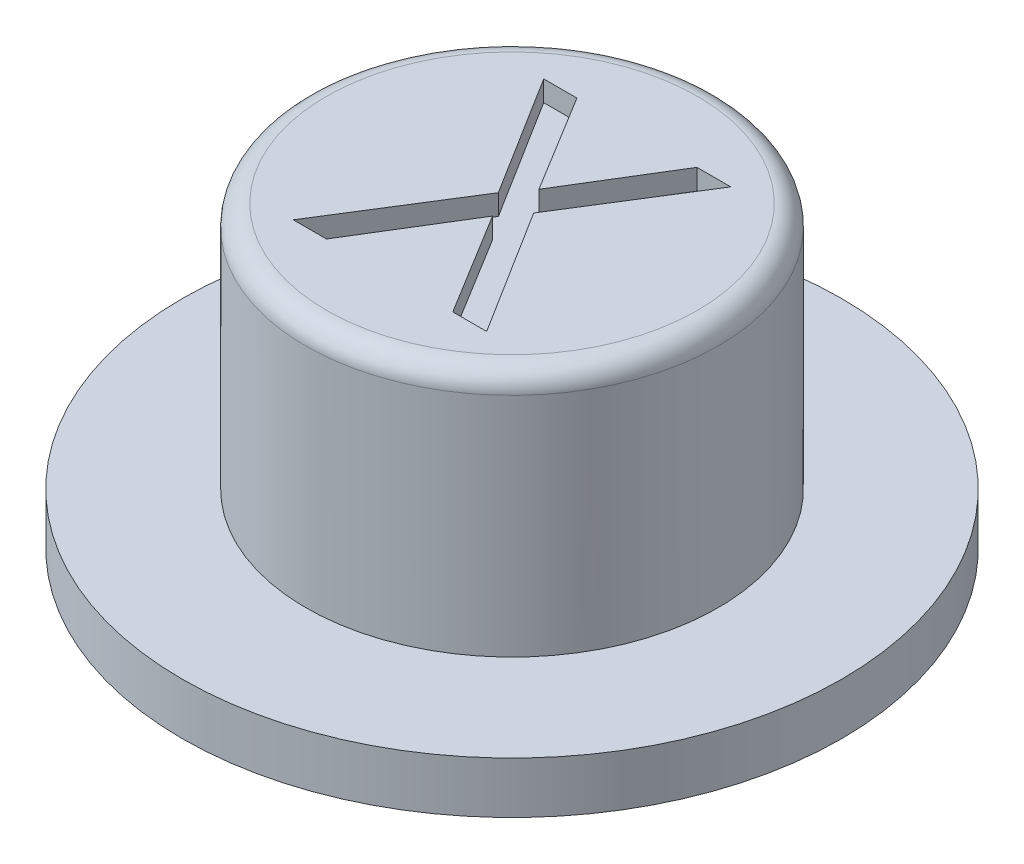
ISO-10303-21;
HEADER;
FILE_DESCRIPTION(('STEP AP214'),'2;1');
FILE_NAME('part.step','',(''),(''),'','','');
FILE_SCHEMA(('AUTOMOTIVE_DESIGN { 1 0 10303 214 1 1 1 1 }'));
ENDSEC;
DATA;
#1=APPLICATION_CONTEXT('core data for automotive mechanical design processes');
#2=APPLICATION_PROTOCOL_DEFINITION('international standard','automotive_design',2000,#1);
#3=PRODUCT_CONTEXT('',#1,'mechanical');
#4=PRODUCT('Part','Part','',(#3));
#5=PRODUCT_RELATED_PRODUCT_CATEGORY('part','',(#4));
#6=PRODUCT_DEFINITION_FORMATION('','',#4);
#7=PRODUCT_DEFINITION_CONTEXT('part definition',#1,'design');
#8=PRODUCT_DEFINITION('design','',#6,#7);
#9=PRODUCT_DEFINITION_SHAPE('','',#8);
#10=(LENGTH_UNIT() NAMED_UNIT(*) SI_UNIT(.MILLI.,.METRE.));
#11=(NAMED_UNIT(*) PLANE_ANGLE_UNIT() SI_UNIT($,.RADIAN.));
#12=(NAMED_UNIT(*) SI_UNIT($,.STERADIAN.) SOLID_ANGLE_UNIT());
#13=UNCERTAINTY_MEASURE_WITH_UNIT(LENGTH_MEASURE(1.E-05),#10,'distance_accuracy_value','');
#14=(GEOMETRIC_REPRESENTATION_CONTEXT(3) GLOBAL_UNCERTAINTY_ASSIGNED_CONTEXT((#13)) GLOBAL_UNIT_ASSIGNED_CONTEXT((#10,
#11,#12)) REPRESENTATION_CONTEXT('',''));
#15=CARTESIAN_POINT('',(0.,0.,0.));
#16=DIRECTION('',(0.,0.,1.));
#17=DIRECTION('',(1.,0.,0.));
#18=AXIS2_PLACEMENT_3D('',#15,#16,#17);
#19=CARTESIAN_POINT('',(0.,7.24999999999999,0.));
#20=DIRECTION('',(0.,-1.,0.));
#21=DIRECTION('',(1.,0.,0.));
#22=AXIS2_PLACEMENT_3D('',#19,#20,#21);
#23=PLANE('',#22);
#24=CARTESIAN_POINT('',(0.,7.24999999999999,0.));
#25=DIRECTION('',(0.,-1.,0.));
#26=DIRECTION('',(1.,0.,0.));
#27=AXIS2_PLACEMENT_3D('',#24,#25,#26);
#28=CIRCLE('',#27,4.49999999999999);
#29=CARTESIAN_POINT('',(4.49999999999999,7.25,0.));
#30=VERTEX_POINT('',#29);
#31=EDGE_CURVE('E41',#30,#30,#28,.F.);
#32=ORIENTED_EDGE('',*,*,#31,.T.);
#33=EDGE_LOOP('',(#32));
#34=FACE_BOUND('',#33,.T.);
#35=DIRECTION('',(-0.530652621464219,0.,-0.847589402560669));
#36=VECTOR('',#35,1.);
#37=CARTESIAN_POINT('',(-0.389423076923096,7.24999999999999,-0.0588942307692309));
#38=LINE('',#37,#36);
#39=CARTESIAN_POINT('',(-0.389423076923096,7.24999999999999,-0.0588942307692309));
#40=VERTEX_POINT('',#39);
#41=CARTESIAN_POINT('',(-2.23076923076925,7.24999999999999,-3.));
#42=VERTEX_POINT('',#41);
#43=EDGE_CURVE('E48',#40,#42,#38,.T.);
#44=ORIENTED_EDGE('',*,*,#43,.T.);
#45=DIRECTION('',(1.,0.,0.));
#46=VECTOR('',#45,1.);
#47=CARTESIAN_POINT('',(-2.23076923076925,7.24999999999999,-3.));
#48=LINE('',#47,#46);
#49=CARTESIAN_POINT('',(-1.42427884615387,7.24999999999999,-3.));
#50=VERTEX_POINT('',#49);
#51=EDGE_CURVE('E167',#42,#50,#48,.T.);
#52=ORIENTED_EDGE('',*,*,#51,.T.);
#53=DIRECTION('',(0.52214745933487,0.,0.852855222596509));
#54=VECTOR('',#53,1.);
#55=CARTESIAN_POINT('',(-1.42427884615387,7.24999999999999,-3.));
#56=LINE('',#55,#54);
#57=CARTESIAN_POINT('',(0.0312499999999809,7.24999999999999,-0.622596153846154));
#58=VERTEX_POINT('',#57);
#59=EDGE_CURVE('E497',#50,#58,#56,.T.);
#60=ORIENTED_EDGE('',*,*,#59,.T.);
#61=DIRECTION('',(0.52214745933487,0.,-0.852855222596509));
#62=VECTOR('',#61,1.);
#63=CARTESIAN_POINT('',(0.0312499999999809,7.24999999999999,-0.622596153846154));
#64=LINE('',#63,#62);
#65=CARTESIAN_POINT('',(1.48677884615383,7.25,-3.));
#66=VERTEX_POINT('',#65);
#67=EDGE_CURVE('E499',#58,#66,#64,.T.);
#68=ORIENTED_EDGE('',*,*,#67,.T.);
#69=DIRECTION('',(1.,0.,0.));
#70=VECTOR('',#69,1.);
#71=CARTESIAN_POINT('',(1.48677884615383,7.25,-3.));
#72=LINE('',#71,#70);
#73=CARTESIAN_POINT('',(2.30769230769229,7.25,-3.));
#74=VERTEX_POINT('',#73);
#75=EDGE_CURVE('E503',#66,#74,#72,.T.);
#76=ORIENTED_EDGE('',*,*,#75,.T.);
#77=DIRECTION('',(-0.530808451043768,0.,0.847491821966747));
#78=VECTOR('',#77,1.);
#79=CARTESIAN_POINT('',(2.30769230769229,7.25,-3.));
#80=LINE('',#79,#78);
#81=CARTESIAN_POINT('',(0.466346153846135,7.24999999999999,-0.0600961538461541));
#82=VERTEX_POINT('',#81);
#83=EDGE_CURVE('E510',#74,#82,#80,.T.);
#84=ORIENTED_EDGE('',*,*,#83,.T.);
#85=DIRECTION('',(0.53113518975577,0.,0.847287088419918));
#86=VECTOR('',#85,1.);
#87=CARTESIAN_POINT('',(0.466346153846135,7.24999999999999,-0.0600961538461541));
#88=LINE('',#87,#86);
#89=CARTESIAN_POINT('',(2.38461538461537,7.25,3.));
#90=VERTEX_POINT('',#89);
#91=EDGE_CURVE('E513',#82,#90,#88,.T.);
#92=ORIENTED_EDGE('',*,*,#91,.T.);
#93=DIRECTION('',(-1.,0.,0.));
#94=VECTOR('',#93,1.);
#95=CARTESIAN_POINT('',(2.38461538461537,7.25,3.));
#96=LINE('',#95,#94);
#97=CARTESIAN_POINT('',(1.5637019230769,7.25,3.));
#98=VERTEX_POINT('',#97);
#99=EDGE_CURVE('E516',#90,#98,#96,.T.);
#100=ORIENTED_EDGE('',*,*,#99,.T.);
#101=DIRECTION('',(-0.52315847749221,0.,-0.852235417844173));
#102=VECTOR('',#101,1.);
#103=CARTESIAN_POINT('',(1.5637019230769,7.25,3.));
#104=LINE('',#103,#102);
#105=CARTESIAN_POINT('',(0.0312499999999809,7.24999999999999,0.503605769230769));
#106=VERTEX_POINT('',#105);
#107=EDGE_CURVE('E473',#98,#106,#104,.T.);
#108=ORIENTED_EDGE('',*,*,#107,.T.);
#109=DIRECTION('',(-0.52315847749221,0.,0.852235417844173));
#110=VECTOR('',#109,1.);
#111=CARTESIAN_POINT('',(0.0312499999999809,7.24999999999999,0.503605769230769));
#112=LINE('',#111,#110);
#113=CARTESIAN_POINT('',(-1.50120192307694,7.24999999999999,3.));
#114=VERTEX_POINT('',#113);
#115=EDGE_CURVE('E470',#106,#114,#112,.T.);
#116=ORIENTED_EDGE('',*,*,#115,.T.);
#117=DIRECTION('',(-1.,0.,0.));
#118=VECTOR('',#117,1.);
#119=CARTESIAN_POINT('',(-1.50120192307694,7.24999999999999,3.));
#120=LINE('',#119,#118);
#121=CARTESIAN_POINT('',(-2.30769230769233,7.24999999999999,3.));
#122=VERTEX_POINT('',#121);
#123=EDGE_CURVE('E464',#114,#122,#120,.T.);
#124=ORIENTED_EDGE('',*,*,#123,.T.);
#125=DIRECTION('',(0.531284987838168,0.,-0.847193166696827));
#126=VECTOR('',#125,1.);
#127=CARTESIAN_POINT('',(-2.30769230769233,7.24999999999999,3.));
#128=LINE('',#127,#126);
#129=EDGE_CURVE('E163',#122,#40,#128,.T.);
#130=ORIENTED_EDGE('',*,*,#129,.T.);
#131=EDGE_LOOP('',(#44,#52,#60,#68,#76,#84,#92,#100,#108,#116,#124,#130));
#132=FACE_BOUND('',#131,.T.);
#133=ADVANCED_FACE('F33',(#34,#132),#23,.F.);
#134=CARTESIAN_POINT('',(0.,0.,0.));
#135=DIRECTION('',(0.,1.,0.));
#136=DIRECTION('',(-1.,0.,0.));
#137=AXIS2_PLACEMENT_3D('',#134,#135,#136);
#138=PLANE('',#137);
#139=CARTESIAN_POINT('',(0.,0.,0.));
#140=DIRECTION('',(0.,1.,0.));
#141=DIRECTION('',(-1.,0.,0.));
#142=AXIS2_PLACEMENT_3D('',#139,#140,#141);
#143=CIRCLE('',#142,7.99999999999998);
#144=CARTESIAN_POINT('',(-7.99999999999996,0.,0.));
#145=VERTEX_POINT('',#144);
#146=EDGE_CURVE('E209',#145,#145,#143,.T.);
#147=ORIENTED_EDGE('',*,*,#146,.F.);
#148=EDGE_LOOP('',(#147));
#149=FACE_BOUND('',#148,.T.);
#150=DIRECTION('',(0.,0.,1.));
#151=VECTOR('',#150,1.);
#152=CARTESIAN_POINT('',(-1.25,0.,-1.75));
#153=LINE('',#152,#151);
#154=CARTESIAN_POINT('',(-1.25,0.,-1.75));
#155=VERTEX_POINT('',#154);
#156=CARTESIAN_POINT('',(-1.25,0.,1.75));
#157=VERTEX_POINT('',#156);
#158=EDGE_CURVE('E56',#155,#157,#153,.T.);
#159=ORIENTED_EDGE('',*,*,#158,.T.);
#160=DIRECTION('',(1.,0.,0.));
#161=VECTOR('',#160,1.);
#162=CARTESIAN_POINT('',(-1.25,0.,1.75));
#163=LINE('',#162,#161);
#164=CARTESIAN_POINT('',(1.25,0.,1.75));
#165=VERTEX_POINT('',#164);
#166=EDGE_CURVE('E170',#157,#165,#163,.T.);
#167=ORIENTED_EDGE('',*,*,#166,.T.);
#168=DIRECTION('',(0.,0.,1.));
#169=VECTOR('',#168,1.);
#170=CARTESIAN_POINT('',(1.25,0.,-1.75));
#171=LINE('',#170,#169);
#172=CARTESIAN_POINT('',(1.25,0.,-1.75));
#173=VERTEX_POINT('',#172);
#174=EDGE_CURVE('E191',#173,#165,#171,.T.);
#175=ORIENTED_EDGE('',*,*,#174,.F.);
#176=DIRECTION('',(1.,0.,0.));
#177=VECTOR('',#176,1.);
#178=CARTESIAN_POINT('',(-1.25,0.,-1.75));
#179=LINE('',#178,#177);
#180=EDGE_CURVE('E180',#155,#173,#179,.T.);
#181=ORIENTED_EDGE('',*,*,#180,.F.);
#182=EDGE_LOOP('',(#159,#167,#175,#181));
#183=FACE_BOUND('',#182,.T.);
#184=ADVANCED_FACE('F229',(#149,#183),#138,.F.);
#185=CARTESIAN_POINT('',(0.,7.25,0.));
#186=DIRECTION('',(0.,1.,0.));
#187=DIRECTION('',(-1.,0.,0.));
#188=AXIS2_PLACEMENT_3D('',#185,#186,#187);
#189=CYLINDRICAL_SURFACE('',#188,7.99999999999998);
#190=CARTESIAN_POINT('',(0.,1.24999999999998,0.));
#191=DIRECTION('',(0.,1.,0.));
#192=DIRECTION('',(-1.,0.,0.));
#193=AXIS2_PLACEMENT_3D('',#190,#191,#192);
#194=CIRCLE('',#193,7.99999999999998);
#195=CARTESIAN_POINT('',(-7.99999999999997,1.24999999999996,0.));
#196=VERTEX_POINT('',#195);
#197=EDGE_CURVE('E206',#196,#196,#194,.T.);
#198=ORIENTED_EDGE('',*,*,#197,.F.);
#199=EDGE_LOOP('',(#198));
#200=FACE_BOUND('',#199,.T.);
#201=ORIENTED_EDGE('',*,*,#146,.T.);
#202=EDGE_LOOP('',(#201));
#203=FACE_BOUND('',#202,.T.);
#204=ADVANCED_FACE('F234',(#200,#203),#189,.T.);
#205=CARTESIAN_POINT('',(5.,1.25,0.));
#206=DIRECTION('',(0.,-1.,0.));
#207=DIRECTION('',(1.,0.,0.));
#208=AXIS2_PLACEMENT_3D('',#205,#206,#207);
#209=PLANE('',#208);
#210=CARTESIAN_POINT('',(0.,1.24999999999999,0.));
#211=DIRECTION('',(0.,1.,0.));
#212=DIRECTION('',(-1.,0.,0.));
#213=AXIS2_PLACEMENT_3D('',#210,#211,#212);
#214=CIRCLE('',#213,4.99999999999998);
#215=CARTESIAN_POINT('',(-4.99999999999997,1.24999999999997,0.));
#216=VERTEX_POINT('',#215);
#217=EDGE_CURVE('E203',#216,#216,#214,.T.);
#218=ORIENTED_EDGE('',*,*,#217,.F.);
#219=EDGE_LOOP('',(#218));
#220=FACE_BOUND('',#219,.T.);
#221=ORIENTED_EDGE('',*,*,#197,.T.);
#222=EDGE_LOOP('',(#221));
#223=FACE_BOUND('',#222,.T.);
#224=ADVANCED_FACE('F243',(#220,#223),#209,.F.);
#225=CARTESIAN_POINT('',(0.,7.25,0.));
#226=DIRECTION('',(0.,1.,0.));
#227=DIRECTION('',(-1.,0.,0.));
#228=AXIS2_PLACEMENT_3D('',#225,#226,#227);
#229=CYLINDRICAL_SURFACE('',#228,4.99999999999999);
#230=CARTESIAN_POINT('',(0.,6.74999999999999,0.));
#231=DIRECTION('',(0.,-1.,0.));
#232=DIRECTION('',(1.,0.,0.));
#233=AXIS2_PLACEMENT_3D('',#230,#231,#232);
#234=CIRCLE('',#233,4.99999999999999);
#235=CARTESIAN_POINT('',(4.99999999999999,6.75000000000001,0.));
#236=VERTEX_POINT('',#235);
#237=EDGE_CURVE('E11',#236,#236,#234,.T.);
#238=ORIENTED_EDGE('',*,*,#237,.T.);
#239=EDGE_LOOP('',(#238));
#240=FACE_BOUND('',#239,.T.);
#241=ORIENTED_EDGE('',*,*,#217,.T.);
#242=EDGE_LOOP('',(#241));
#243=FACE_BOUND('',#242,.T.);
#244=ADVANCED_FACE('F240',(#240,#243),#229,.T.);
#245=CARTESIAN_POINT('',(-1.25,3.5,-1.75));
#246=DIRECTION('',(1.,0.,0.));
#247=DIRECTION('',(0.,1.,0.));
#248=AXIS2_PLACEMENT_3D('',#245,#246,#247);
#249=PLANE('',#248);
#250=ORIENTED_EDGE('',*,*,#158,.F.);
#251=DIRECTION('',(0.,-1.,0.));
#252=VECTOR('',#251,1.);
#253=CARTESIAN_POINT('',(-1.25,3.5,-1.75));
#254=LINE('',#253,#252);
#255=CARTESIAN_POINT('',(-1.25,3.5,-1.75));
#256=VERTEX_POINT('',#255);
#257=EDGE_CURVE('E187',#256,#155,#254,.T.);
#258=ORIENTED_EDGE('',*,*,#257,.F.);
#259=DIRECTION('',(0.,0.,1.));
#260=VECTOR('',#259,1.);
#261=CARTESIAN_POINT('',(-1.25,3.5,-1.75));
#262=LINE('',#261,#260);
#263=CARTESIAN_POINT('',(-1.25,3.5,1.75));
#264=VERTEX_POINT('',#263);
#265=EDGE_CURVE('E176',#256,#264,#262,.T.);
#266=ORIENTED_EDGE('',*,*,#265,.T.);
#267=DIRECTION('',(0.,-1.,0.));
#268=VECTOR('',#267,1.);
#269=CARTESIAN_POINT('',(-1.25,3.5,1.75));
#270=LINE('',#269,#268);
#271=EDGE_CURVE('E201',#264,#157,#270,.T.);
#272=ORIENTED_EDGE('',*,*,#271,.T.);
#273=EDGE_LOOP('',(#250,#258,#266,#272));
#274=FACE_BOUND('',#273,.T.);
#275=ADVANCED_FACE('F238',(#274),#249,.T.);
#276=CARTESIAN_POINT('',(-1.25,3.5,1.75));
#277=DIRECTION('',(0.,0.,-1.));
#278=DIRECTION('',(-1.,0.,0.));
#279=AXIS2_PLACEMENT_3D('',#276,#277,#278);
#280=PLANE('',#279);
#281=ORIENTED_EDGE('',*,*,#166,.F.);
#282=ORIENTED_EDGE('',*,*,#271,.F.);
#283=DIRECTION('',(1.,0.,0.));
#284=VECTOR('',#283,1.);
#285=CARTESIAN_POINT('',(-1.25,3.5,1.75));
#286=LINE('',#285,#284);
#287=CARTESIAN_POINT('',(1.25,3.5,1.75));
#288=VERTEX_POINT('',#287);
#289=EDGE_CURVE('E179',#264,#288,#286,.T.);
#290=ORIENTED_EDGE('',*,*,#289,.T.);
#291=DIRECTION('',(0.,-1.,0.));
#292=VECTOR('',#291,1.);
#293=CARTESIAN_POINT('',(1.25,3.5,1.75));
#294=LINE('',#293,#292);
#295=EDGE_CURVE('E199',#288,#165,#294,.T.);
#296=ORIENTED_EDGE('',*,*,#295,.T.);
#297=EDGE_LOOP('',(#281,#282,#290,#296));
#298=FACE_BOUND('',#297,.T.);
#299=ADVANCED_FACE('F265',(#298),#280,.T.);
#300=CARTESIAN_POINT('',(1.25,3.5,-1.75));
#301=DIRECTION('',(1.,0.,0.));
#302=DIRECTION('',(0.,1.,0.));
#303=AXIS2_PLACEMENT_3D('',#300,#301,#302);
#304=PLANE('',#303);
#305=ORIENTED_EDGE('',*,*,#174,.T.);
#306=ORIENTED_EDGE('',*,*,#295,.F.);
#307=DIRECTION('',(0.,0.,1.));
#308=VECTOR('',#307,1.);
#309=CARTESIAN_POINT('',(1.25,3.5,-1.75));
#310=LINE('',#309,#308);
#311=CARTESIAN_POINT('',(1.25,3.5,-1.75));
#312=VERTEX_POINT('',#311);
#313=EDGE_CURVE('E182',#312,#288,#310,.T.);
#314=ORIENTED_EDGE('',*,*,#313,.F.);
#315=DIRECTION('',(0.,-1.,0.));
#316=VECTOR('',#315,1.);
#317=CARTESIAN_POINT('',(1.25,3.5,-1.75));
#318=LINE('',#317,#316);
#319=EDGE_CURVE('E197',#312,#173,#318,.T.);
#320=ORIENTED_EDGE('',*,*,#319,.T.);
#321=EDGE_LOOP('',(#305,#306,#314,#320));
#322=FACE_BOUND('',#321,.T.);
#323=ADVANCED_FACE('F267',(#322),#304,.F.);
#324=CARTESIAN_POINT('',(-1.25,3.5,-1.75));
#325=DIRECTION('',(0.,0.,-1.));
#326=DIRECTION('',(-1.,0.,0.));
#327=AXIS2_PLACEMENT_3D('',#324,#325,#326);
#328=PLANE('',#327);
#329=ORIENTED_EDGE('',*,*,#180,.T.);
#330=ORIENTED_EDGE('',*,*,#319,.F.);
#331=DIRECTION('',(1.,0.,0.));
#332=VECTOR('',#331,1.);
#333=CARTESIAN_POINT('',(-1.25,3.5,-1.75));
#334=LINE('',#333,#332);
#335=EDGE_CURVE('E185',#256,#312,#334,.T.);
#336=ORIENTED_EDGE('',*,*,#335,.F.);
#337=ORIENTED_EDGE('',*,*,#257,.T.);
#338=EDGE_LOOP('',(#329,#330,#336,#337));
#339=FACE_BOUND('',#338,.T.);
#340=ADVANCED_FACE('F224',(#339),#328,.F.);
#341=CARTESIAN_POINT('',(0.,3.5,0.));
#342=DIRECTION('',(0.,1.,0.));
#343=DIRECTION('',(-1.,0.,0.));
#344=AXIS2_PLACEMENT_3D('',#341,#342,#343);
#345=PLANE('',#344);
#346=ORIENTED_EDGE('',*,*,#265,.F.);
#347=ORIENTED_EDGE('',*,*,#335,.T.);
#348=ORIENTED_EDGE('',*,*,#313,.T.);
#349=ORIENTED_EDGE('',*,*,#289,.F.);
#350=EDGE_LOOP('',(#346,#347,#348,#349));
#351=FACE_BOUND('',#350,.T.);
#352=ADVANCED_FACE('F217',(#351),#345,.F.);
#353=CARTESIAN_POINT('',(0.,6.74999999999999,0.));
#354=DIRECTION('',(0.,-1.,0.));
#355=DIRECTION('',(1.,0.,0.));
#356=AXIS2_PLACEMENT_3D('',#353,#354,#355);
#357=TOROIDAL_SURFACE('',#356,4.49999999999999,0.5);
#358=ORIENTED_EDGE('',*,*,#237,.F.);
#359=EDGE_LOOP('',(#358));
#360=FACE_BOUND('',#359,.T.);
#361=ORIENTED_EDGE('',*,*,#31,.F.);
#362=EDGE_LOOP('',(#361));
#363=FACE_BOUND('',#362,.T.);
#364=ADVANCED_FACE('F35',(#360,#363),#357,.T.);
#365=CARTESIAN_POINT('',(-0.389423076923095,6.74999999999999,-0.0588942307692309));
#366=DIRECTION('',(0.847589402560669,0.,-0.530652621464219));
#367=DIRECTION('',(-0.53065262146422,0.,-0.847589402560669));
#368=AXIS2_PLACEMENT_3D('',#365,#366,#367);
#369=PLANE('',#368);
#370=ORIENTED_EDGE('',*,*,#43,.F.);
#371=DIRECTION('',(0.,1.,0.));
#372=VECTOR('',#371,1.);
#373=CARTESIAN_POINT('',(-0.389423076923095,6.74999999999999,-0.0588942307692309));
#374=LINE('',#373,#372);
#375=CARTESIAN_POINT('',(-0.389423076923095,6.74999999999999,-0.0588942307692309));
#376=VERTEX_POINT('',#375);
#377=EDGE_CURVE('E162',#376,#40,#374,.T.);
#378=ORIENTED_EDGE('',*,*,#377,.F.);
#379=DIRECTION('',(-0.530652621464219,0.,-0.847589402560669));
#380=VECTOR('',#379,1.);
#381=CARTESIAN_POINT('',(-0.389423076923095,6.74999999999999,-0.0588942307692309));
#382=LINE('',#381,#380);
#383=CARTESIAN_POINT('',(-2.23076923076925,6.74999999999999,-3.));
#384=VERTEX_POINT('',#383);
#385=EDGE_CURVE('E153',#376,#384,#382,.T.);
#386=ORIENTED_EDGE('',*,*,#385,.T.);
#387=DIRECTION('',(0.,1.,0.));
#388=VECTOR('',#387,1.);
#389=CARTESIAN_POINT('',(-2.23076923076925,6.74999999999999,-3.));
#390=LINE('',#389,#388);
#391=EDGE_CURVE('E161',#384,#42,#390,.T.);
#392=ORIENTED_EDGE('',*,*,#391,.T.);
#393=EDGE_LOOP('',(#370,#378,#386,#392));
#394=FACE_BOUND('',#393,.T.);
#395=ADVANCED_FACE('F160',(#394),#369,.T.);
#396=CARTESIAN_POINT('',(-2.23076923076925,6.74999999999999,-3.));
#397=DIRECTION('',(0.,0.,1.));
#398=DIRECTION('',(1.,0.,0.));
#399=AXIS2_PLACEMENT_3D('',#396,#397,#398);
#400=PLANE('',#399);
#401=ORIENTED_EDGE('',*,*,#51,.F.);
#402=ORIENTED_EDGE('',*,*,#391,.F.);
#403=DIRECTION('',(1.,0.,0.));
#404=VECTOR('',#403,1.);
#405=CARTESIAN_POINT('',(-2.23076923076925,6.74999999999999,-3.));
#406=LINE('',#405,#404);
#407=CARTESIAN_POINT('',(-1.42427884615386,6.74999999999999,-3.));
#408=VERTEX_POINT('',#407);
#409=EDGE_CURVE('E149',#384,#408,#406,.T.);
#410=ORIENTED_EDGE('',*,*,#409,.T.);
#411=DIRECTION('',(0.,1.,0.));
#412=VECTOR('',#411,1.);
#413=CARTESIAN_POINT('',(-1.42427884615386,6.74999999999999,-3.));
#414=LINE('',#413,#412);
#415=EDGE_CURVE('E168',#408,#50,#414,.T.);
#416=ORIENTED_EDGE('',*,*,#415,.T.);
#417=EDGE_LOOP('',(#401,#402,#410,#416));
#418=FACE_BOUND('',#417,.T.);
#419=ADVANCED_FACE('F165',(#418),#400,.T.);
#420=CARTESIAN_POINT('',(-1.42427884615386,6.74999999999999,-3.));
#421=DIRECTION('',(-0.852855222596509,0.,0.52214745933487));
#422=DIRECTION('',(0.52214745933487,0.,0.852855222596509));
#423=AXIS2_PLACEMENT_3D('',#420,#421,#422);
#424=PLANE('',#423);
#425=ORIENTED_EDGE('',*,*,#59,.F.);
#426=ORIENTED_EDGE('',*,*,#415,.F.);
#427=DIRECTION('',(0.52214745933487,0.,0.852855222596509));
#428=VECTOR('',#427,1.);
#429=CARTESIAN_POINT('',(-1.42427884615386,6.74999999999999,-3.));
#430=LINE('',#429,#428);
#431=CARTESIAN_POINT('',(0.0312499999999822,6.74999999999999,-0.622596153846154));
#432=VERTEX_POINT('',#431);
#433=EDGE_CURVE('E155',#408,#432,#430,.T.);
#434=ORIENTED_EDGE('',*,*,#433,.T.);
#435=DIRECTION('',(0.,1.,0.));
#436=VECTOR('',#435,1.);
#437=CARTESIAN_POINT('',(0.0312499999999822,6.74999999999999,-0.622596153846154));
#438=LINE('',#437,#436);
#439=EDGE_CURVE('E172',#432,#58,#438,.T.);
#440=ORIENTED_EDGE('',*,*,#439,.T.);
#441=EDGE_LOOP('',(#425,#426,#434,#440));
#442=FACE_BOUND('',#441,.T.);
#443=ADVANCED_FACE('F278',(#442),#424,.T.);
#444=CARTESIAN_POINT('',(0.0312499999999822,6.74999999999999,-0.622596153846154));
#445=DIRECTION('',(0.852855222596509,0.,0.52214745933487));
#446=DIRECTION('',(0.52214745933487,0.,-0.852855222596509));
#447=AXIS2_PLACEMENT_3D('',#444,#445,#446);
#448=PLANE('',#447);
#449=ORIENTED_EDGE('',*,*,#67,.F.);
#450=ORIENTED_EDGE('',*,*,#439,.F.);
#451=DIRECTION('',(0.52214745933487,0.,-0.852855222596509));
#452=VECTOR('',#451,1.);
#453=CARTESIAN_POINT('',(0.0312499999999822,6.74999999999999,-0.622596153846154));
#454=LINE('',#453,#452);
#455=CARTESIAN_POINT('',(1.48677884615383,6.75,-3.));
#456=VERTEX_POINT('',#455);
#457=EDGE_CURVE('E541',#432,#456,#454,.T.);
#458=ORIENTED_EDGE('',*,*,#457,.T.);
#459=DIRECTION('',(0.,1.,0.));
#460=VECTOR('',#459,1.);
#461=CARTESIAN_POINT('',(1.48677884615383,6.75,-3.));
#462=LINE('',#461,#460);
#463=EDGE_CURVE('E492',#456,#66,#462,.T.);
#464=ORIENTED_EDGE('',*,*,#463,.T.);
#465=EDGE_LOOP('',(#449,#450,#458,#464));
#466=FACE_BOUND('',#465,.T.);
#467=ADVANCED_FACE('F281',(#466),#448,.T.);
#468=CARTESIAN_POINT('',(1.48677884615383,6.75,-3.));
#469=DIRECTION('',(0.,0.,1.));
#470=DIRECTION('',(1.,0.,0.));
#471=AXIS2_PLACEMENT_3D('',#468,#469,#470);
#472=PLANE('',#471);
#473=ORIENTED_EDGE('',*,*,#75,.F.);
#474=ORIENTED_EDGE('',*,*,#463,.F.);
#475=DIRECTION('',(1.,0.,0.));
#476=VECTOR('',#475,1.);
#477=CARTESIAN_POINT('',(1.48677884615383,6.75,-3.));
#478=LINE('',#477,#476);
#479=CARTESIAN_POINT('',(2.30769230769229,6.75,-3.));
#480=VERTEX_POINT('',#479);
#481=EDGE_CURVE('E539',#456,#480,#478,.T.);
#482=ORIENTED_EDGE('',*,*,#481,.T.);
#483=DIRECTION('',(0.,1.,0.));
#484=VECTOR('',#483,1.);
#485=CARTESIAN_POINT('',(2.30769230769229,6.75,-3.));
#486=LINE('',#485,#484);
#487=EDGE_CURVE('E490',#480,#74,#486,.T.);
#488=ORIENTED_EDGE('',*,*,#487,.T.);
#489=EDGE_LOOP('',(#473,#474,#482,#488));
#490=FACE_BOUND('',#489,.T.);
#491=ADVANCED_FACE('F285',(#490),#472,.T.);
#492=CARTESIAN_POINT('',(2.30769230769229,6.75,-3.));
#493=DIRECTION('',(-0.847491821966747,0.,-0.530808451043768));
#494=DIRECTION('',(-0.530808451043768,0.,0.847491821966747));
#495=AXIS2_PLACEMENT_3D('',#492,#493,#494);
#496=PLANE('',#495);
#497=ORIENTED_EDGE('',*,*,#83,.F.);
#498=ORIENTED_EDGE('',*,*,#487,.F.);
#499=DIRECTION('',(-0.530808451043768,0.,0.847491821966747));
#500=VECTOR('',#499,1.);
#501=CARTESIAN_POINT('',(2.30769230769229,6.75,-3.));
#502=LINE('',#501,#500);
#503=CARTESIAN_POINT('',(0.466346153846136,6.74999999999999,-0.0600961538461541));
#504=VERTEX_POINT('',#503);
#505=EDGE_CURVE('E537',#480,#504,#502,.T.);
#506=ORIENTED_EDGE('',*,*,#505,.T.);
#507=DIRECTION('',(0.,1.,0.));
#508=VECTOR('',#507,1.);
#509=CARTESIAN_POINT('',(0.466346153846136,6.74999999999999,-0.0600961538461541));
#510=LINE('',#509,#508);
#511=EDGE_CURVE('E488',#504,#82,#510,.T.);
#512=ORIENTED_EDGE('',*,*,#511,.T.);
#513=EDGE_LOOP('',(#497,#498,#506,#512));
#514=FACE_BOUND('',#513,.T.);
#515=ADVANCED_FACE('F289',(#514),#496,.T.);
#516=CARTESIAN_POINT('',(0.466346153846136,6.74999999999999,-0.0600961538461541));
#517=DIRECTION('',(-0.847287088419918,0.,0.53113518975577));
#518=DIRECTION('',(0.53113518975577,0.,0.847287088419918));
#519=AXIS2_PLACEMENT_3D('',#516,#517,#518);
#520=PLANE('',#519);
#521=ORIENTED_EDGE('',*,*,#91,.F.);
#522=ORIENTED_EDGE('',*,*,#511,.F.);
#523=DIRECTION('',(0.53113518975577,0.,0.847287088419918));
#524=VECTOR('',#523,1.);
#525=CARTESIAN_POINT('',(0.466346153846136,6.74999999999999,-0.0600961538461541));
#526=LINE('',#525,#524);
#527=CARTESIAN_POINT('',(2.38461538461537,6.75,3.));
#528=VERTEX_POINT('',#527);
#529=EDGE_CURVE('E535',#504,#528,#526,.T.);
#530=ORIENTED_EDGE('',*,*,#529,.T.);
#531=DIRECTION('',(0.,1.,0.));
#532=VECTOR('',#531,1.);
#533=CARTESIAN_POINT('',(2.38461538461537,6.75,3.));
#534=LINE('',#533,#532);
#535=EDGE_CURVE('E486',#528,#90,#534,.T.);
#536=ORIENTED_EDGE('',*,*,#535,.T.);
#537=EDGE_LOOP('',(#521,#522,#530,#536));
#538=FACE_BOUND('',#537,.T.);
#539=ADVANCED_FACE('F293',(#538),#520,.T.);
#540=CARTESIAN_POINT('',(2.38461538461537,6.75,3.));
#541=DIRECTION('',(0.,0.,-1.));
#542=DIRECTION('',(-1.,0.,0.));
#543=AXIS2_PLACEMENT_3D('',#540,#541,#542);
#544=PLANE('',#543);
#545=ORIENTED_EDGE('',*,*,#99,.F.);
#546=ORIENTED_EDGE('',*,*,#535,.F.);
#547=DIRECTION('',(-1.,0.,0.));
#548=VECTOR('',#547,1.);
#549=CARTESIAN_POINT('',(2.38461538461537,6.75,3.));
#550=LINE('',#549,#548);
#551=CARTESIAN_POINT('',(1.56370192307691,6.75,3.));
#552=VERTEX_POINT('',#551);
#553=EDGE_CURVE('E533',#528,#552,#550,.T.);
#554=ORIENTED_EDGE('',*,*,#553,.T.);
#555=DIRECTION('',(0.,1.,0.));
#556=VECTOR('',#555,1.);
#557=CARTESIAN_POINT('',(1.56370192307691,6.75,3.));
#558=LINE('',#557,#556);
#559=EDGE_CURVE('E484',#552,#98,#558,.T.);
#560=ORIENTED_EDGE('',*,*,#559,.T.);
#561=EDGE_LOOP('',(#545,#546,#554,#560));
#562=FACE_BOUND('',#561,.T.);
#563=ADVANCED_FACE('F297',(#562),#544,.T.);
#564=CARTESIAN_POINT('',(1.56370192307691,6.75,3.));
#565=DIRECTION('',(0.852235417844173,0.,-0.52315847749221));
#566=DIRECTION('',(-0.52315847749221,0.,-0.852235417844173));
#567=AXIS2_PLACEMENT_3D('',#564,#565,#566);
#568=PLANE('',#567);
#569=ORIENTED_EDGE('',*,*,#107,.F.);
#570=ORIENTED_EDGE('',*,*,#559,.F.);
#571=DIRECTION('',(-0.52315847749221,0.,-0.852235417844173));
#572=VECTOR('',#571,1.);
#573=CARTESIAN_POINT('',(1.56370192307691,6.75,3.));
#574=LINE('',#573,#572);
#575=CARTESIAN_POINT('',(0.0312499999999822,6.74999999999999,0.503605769230769));
#576=VERTEX_POINT('',#575);
#577=EDGE_CURVE('E523',#552,#576,#574,.T.);
#578=ORIENTED_EDGE('',*,*,#577,.T.);
#579=DIRECTION('',(0.,1.,0.));
#580=VECTOR('',#579,1.);
#581=CARTESIAN_POINT('',(0.0312499999999822,6.74999999999999,0.503605769230769));
#582=LINE('',#581,#580);
#583=EDGE_CURVE('E482',#576,#106,#582,.T.);
#584=ORIENTED_EDGE('',*,*,#583,.T.);
#585=EDGE_LOOP('',(#569,#570,#578,#584));
#586=FACE_BOUND('',#585,.T.);
#587=ADVANCED_FACE('F301',(#586),#568,.T.);
#588=CARTESIAN_POINT('',(0.0312499999999822,6.74999999999999,0.503605769230769));
#589=DIRECTION('',(-0.852235417844173,0.,-0.52315847749221));
#590=DIRECTION('',(-0.52315847749221,0.,0.852235417844173));
#591=AXIS2_PLACEMENT_3D('',#588,#589,#590);
#592=PLANE('',#591);
#593=ORIENTED_EDGE('',*,*,#115,.F.);
#594=ORIENTED_EDGE('',*,*,#583,.F.);
#595=DIRECTION('',(-0.52315847749221,0.,0.852235417844173));
#596=VECTOR('',#595,1.);
#597=CARTESIAN_POINT('',(0.0312499999999822,6.74999999999999,0.503605769230769));
#598=LINE('',#597,#596);
#599=CARTESIAN_POINT('',(-1.50120192307694,6.74999999999999,3.));
#600=VERTEX_POINT('',#599);
#601=EDGE_CURVE('E525',#576,#600,#598,.T.);
#602=ORIENTED_EDGE('',*,*,#601,.T.);
#603=DIRECTION('',(0.,1.,0.));
#604=VECTOR('',#603,1.);
#605=CARTESIAN_POINT('',(-1.50120192307694,6.74999999999999,3.));
#606=LINE('',#605,#604);
#607=EDGE_CURVE('E480',#600,#114,#606,.T.);
#608=ORIENTED_EDGE('',*,*,#607,.T.);
#609=EDGE_LOOP('',(#593,#594,#602,#608));
#610=FACE_BOUND('',#609,.T.);
#611=ADVANCED_FACE('F305',(#610),#592,.T.);
#612=CARTESIAN_POINT('',(-1.50120192307694,6.74999999999999,3.));
#613=DIRECTION('',(0.,0.,-1.));
#614=DIRECTION('',(-1.,0.,0.));
#615=AXIS2_PLACEMENT_3D('',#612,#613,#614);
#616=PLANE('',#615);
#617=ORIENTED_EDGE('',*,*,#123,.F.);
#618=ORIENTED_EDGE('',*,*,#607,.F.);
#619=DIRECTION('',(-1.,0.,0.));
#620=VECTOR('',#619,1.);
#621=CARTESIAN_POINT('',(-1.50120192307694,6.74999999999999,3.));
#622=LINE('',#621,#620);
#623=CARTESIAN_POINT('',(-2.30769230769233,6.74999999999999,3.));
#624=VERTEX_POINT('',#623);
#625=EDGE_CURVE('E527',#600,#624,#622,.T.);
#626=ORIENTED_EDGE('',*,*,#625,.T.);
#627=DIRECTION('',(0.,1.,0.));
#628=VECTOR('',#627,1.);
#629=CARTESIAN_POINT('',(-2.30769230769233,6.74999999999999,3.));
#630=LINE('',#629,#628);
#631=EDGE_CURVE('E463',#624,#122,#630,.T.);
#632=ORIENTED_EDGE('',*,*,#631,.T.);
#633=EDGE_LOOP('',(#617,#618,#626,#632));
#634=FACE_BOUND('',#633,.T.);
#635=ADVANCED_FACE('F309',(#634),#616,.T.);
#636=CARTESIAN_POINT('',(-2.30769230769233,6.74999999999999,3.));
#637=DIRECTION('',(0.847193166696827,0.,0.531284987838168));
#638=DIRECTION('',(0.531284987838168,0.,-0.847193166696827));
#639=AXIS2_PLACEMENT_3D('',#636,#637,#638);
#640=PLANE('',#639);
#641=ORIENTED_EDGE('',*,*,#129,.F.);
#642=ORIENTED_EDGE('',*,*,#631,.F.);
#643=DIRECTION('',(0.531284987838168,0.,-0.847193166696827));
#644=VECTOR('',#643,1.);
#645=CARTESIAN_POINT('',(-2.30769230769233,6.74999999999999,3.));
#646=LINE('',#645,#644);
#647=EDGE_CURVE('E478',#624,#376,#646,.T.);
#648=ORIENTED_EDGE('',*,*,#647,.T.);
#649=ORIENTED_EDGE('',*,*,#377,.T.);
#650=EDGE_LOOP('',(#641,#642,#648,#649));
#651=FACE_BOUND('',#650,.T.);
#652=ADVANCED_FACE('F313',(#651),#640,.T.);
#653=CARTESIAN_POINT('',(0.,6.74999999999999,0.));
#654=DIRECTION('',(0.,-1.,0.));
#655=DIRECTION('',(1.,0.,0.));
#656=AXIS2_PLACEMENT_3D('',#653,#654,#655);
#657=PLANE('',#656);
#658=ORIENTED_EDGE('',*,*,#385,.F.);
#659=ORIENTED_EDGE('',*,*,#647,.F.);
#660=ORIENTED_EDGE('',*,*,#625,.F.);
#661=ORIENTED_EDGE('',*,*,#601,.F.);
#662=ORIENTED_EDGE('',*,*,#577,.F.);
#663=ORIENTED_EDGE('',*,*,#553,.F.);
#664=ORIENTED_EDGE('',*,*,#529,.F.);
#665=ORIENTED_EDGE('',*,*,#505,.F.);
#666=ORIENTED_EDGE('',*,*,#481,.F.);
#667=ORIENTED_EDGE('',*,*,#457,.F.);
#668=ORIENTED_EDGE('',*,*,#433,.F.);
#669=ORIENTED_EDGE('',*,*,#409,.F.);
#670=EDGE_LOOP('',(#658,#659,#660,#661,#662,#663,#664,#665,#666,#667,#668,#669));
#671=FACE_BOUND('',#670,.T.);
#672=ADVANCED_FACE('F151',(#671),#657,.F.);
#673=CLOSED_SHELL('',(#133,#184,#204,#224,#244,#275,#299,#323,#340,#352,#364,#395,#419,#443,
#467,#491,#515,#539,#563,#587,#611,#635,#652,#672));
#674=MANIFOLD_SOLID_BREP('B2',#673);
#675=ADVANCED_BREP_SHAPE_REPRESENTATION('',(#18,#674),#14);
#676=SHAPE_DEFINITION_REPRESENTATION(#9,#675);
ENDSEC;
END-ISO-10303-21;
